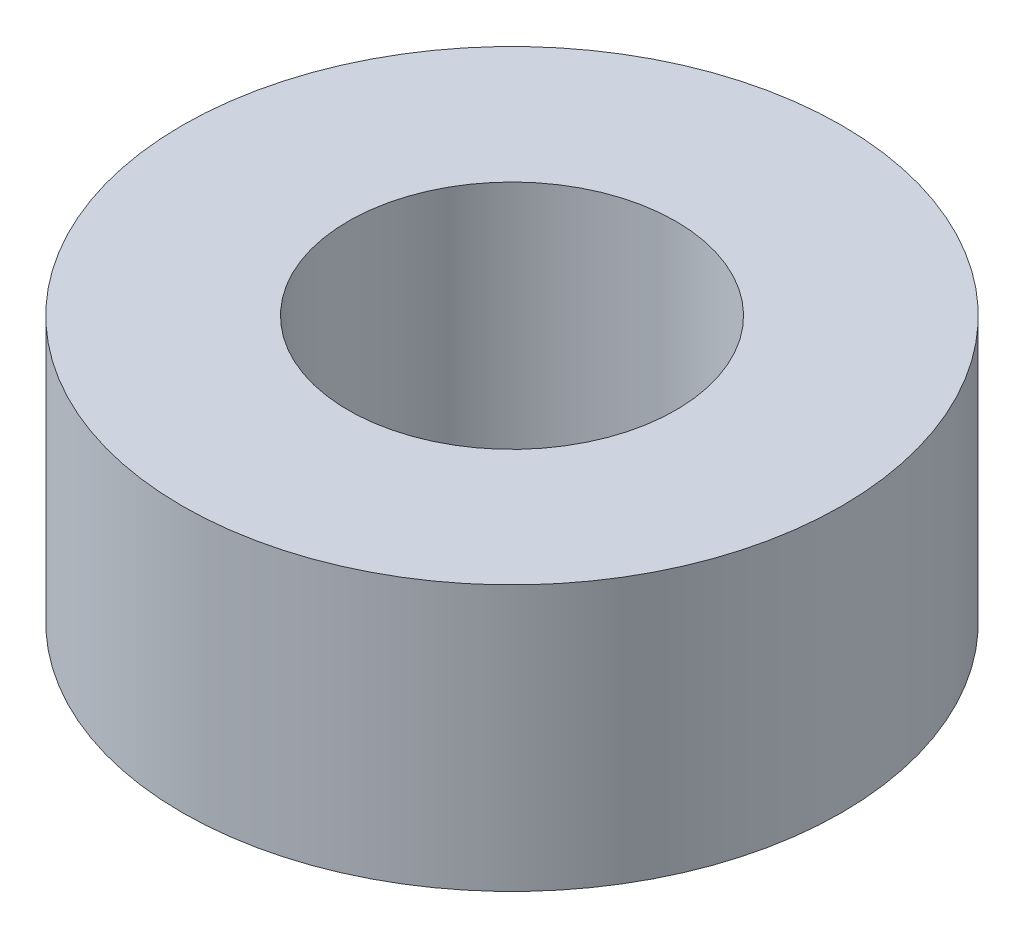
ISO-10303-21;
HEADER;
FILE_DESCRIPTION(('STEP AP214'),'2;1');
FILE_NAME('part.step','',(''),(''),'','','');
FILE_SCHEMA(('AUTOMOTIVE_DESIGN { 1 0 10303 214 1 1 1 1 }'));
ENDSEC;
DATA;
#1=APPLICATION_CONTEXT('core data for automotive mechanical design processes');
#2=APPLICATION_PROTOCOL_DEFINITION('international standard','automotive_design',2000,#1);
#3=PRODUCT_CONTEXT('',#1,'mechanical');
#4=PRODUCT('Part','Part','',(#3));
#5=PRODUCT_RELATED_PRODUCT_CATEGORY('part','',(#4));
#6=PRODUCT_DEFINITION_FORMATION('','',#4);
#7=PRODUCT_DEFINITION_CONTEXT('part definition',#1,'design');
#8=PRODUCT_DEFINITION('design','',#6,#7);
#9=PRODUCT_DEFINITION_SHAPE('','',#8);
#10=(LENGTH_UNIT() NAMED_UNIT(*) SI_UNIT(.MILLI.,.METRE.));
#11=(NAMED_UNIT(*) PLANE_ANGLE_UNIT() SI_UNIT($,.RADIAN.));
#12=(NAMED_UNIT(*) SI_UNIT($,.STERADIAN.) SOLID_ANGLE_UNIT());
#13=UNCERTAINTY_MEASURE_WITH_UNIT(LENGTH_MEASURE(1.E-05),#10,'distance_accuracy_value','');
#14=(GEOMETRIC_REPRESENTATION_CONTEXT(3) GLOBAL_UNCERTAINTY_ASSIGNED_CONTEXT((#13)) GLOBAL_UNIT_ASSIGNED_CONTEXT((#10,
#11,#12)) REPRESENTATION_CONTEXT('',''));
#15=CARTESIAN_POINT('',(0.,0.,0.));
#16=DIRECTION('',(0.,0.,1.));
#17=DIRECTION('',(1.,0.,0.));
#18=AXIS2_PLACEMENT_3D('',#15,#16,#17);
#19=CARTESIAN_POINT('',(0.,7.62,0.));
#20=DIRECTION('',(0.,1.,0.));
#21=DIRECTION('',(0.,0.,1.));
#22=AXIS2_PLACEMENT_3D('',#19,#20,#21);
#23=PLANE('',#22);
#24=CARTESIAN_POINT('',(0.,7.62,0.));
#25=DIRECTION('',(0.,1.,0.));
#26=DIRECTION('',(0.,0.,1.));
#27=AXIS2_PLACEMENT_3D('',#24,#25,#26);
#28=CIRCLE('',#27,9.4615);
#29=CARTESIAN_POINT('',(0.,7.62,-9.4615));
#30=VERTEX_POINT('',#29);
#31=EDGE_CURVE('E10',#30,#30,#28,.T.);
#32=ORIENTED_EDGE('',*,*,#31,.T.);
#33=EDGE_LOOP('',(#32));
#34=FACE_BOUND('',#33,.T.);
#35=CARTESIAN_POINT('',(0.,7.62,0.));
#36=DIRECTION('',(0.,1.,0.));
#37=DIRECTION('',(0.,0.,1.));
#38=AXIS2_PLACEMENT_3D('',#35,#36,#37);
#39=CIRCLE('',#38,4.699);
#40=CARTESIAN_POINT('',(0.,7.62,-4.699));
#41=VERTEX_POINT('',#40);
#42=EDGE_CURVE('E52',#41,#41,#39,.T.);
#43=ORIENTED_EDGE('',*,*,#42,.F.);
#44=EDGE_LOOP('',(#43));
#45=FACE_BOUND('',#44,.T.);
#46=ADVANCED_FACE('F41',(#34,#45),#23,.T.);
#47=CARTESIAN_POINT('',(0.,0.,0.));
#48=DIRECTION('',(0.,1.,0.));
#49=DIRECTION('',(0.,0.,1.));
#50=AXIS2_PLACEMENT_3D('',#47,#48,#49);
#51=PLANE('',#50);
#52=CARTESIAN_POINT('',(0.,0.,0.));
#53=DIRECTION('',(0.,1.,0.));
#54=DIRECTION('',(0.,0.,1.));
#55=AXIS2_PLACEMENT_3D('',#52,#53,#54);
#56=CIRCLE('',#55,9.4615);
#57=CARTESIAN_POINT('',(0.,0.,-9.4615));
#58=VERTEX_POINT('',#57);
#59=EDGE_CURVE('E45',#58,#58,#56,.T.);
#60=ORIENTED_EDGE('',*,*,#59,.F.);
#61=EDGE_LOOP('',(#60));
#62=FACE_BOUND('',#61,.T.);
#63=CARTESIAN_POINT('',(0.,0.,0.));
#64=DIRECTION('',(0.,1.,0.));
#65=DIRECTION('',(0.,0.,1.));
#66=AXIS2_PLACEMENT_3D('',#63,#64,#65);
#67=CIRCLE('',#66,4.699);
#68=CARTESIAN_POINT('',(0.,0.,-4.699));
#69=VERTEX_POINT('',#68);
#70=EDGE_CURVE('E54',#69,#69,#67,.T.);
#71=ORIENTED_EDGE('',*,*,#70,.T.);
#72=EDGE_LOOP('',(#71));
#73=FACE_BOUND('',#72,.T.);
#74=ADVANCED_FACE('F64',(#62,#73),#51,.F.);
#75=CARTESIAN_POINT('',(0.,7.62,0.));
#76=DIRECTION('',(0.,-1.,0.));
#77=DIRECTION('',(0.,0.,-1.));
#78=AXIS2_PLACEMENT_3D('',#75,#76,#77);
#79=CYLINDRICAL_SURFACE('',#78,9.4615);
#80=CARTESIAN_POINT('',(0.,7.62,-9.4615));
#81=CARTESIAN_POINT('',(0.,7.540625,-9.4615));
#82=CARTESIAN_POINT('',(0.,7.46125,-9.4615));
#83=CARTESIAN_POINT('',(0.,7.3025,-9.4615));
#84=CARTESIAN_POINT('',(0.,7.223125,-9.4615));
#85=CARTESIAN_POINT('',(0.,7.064375,-9.4615));
#86=CARTESIAN_POINT('',(0.,6.985,-9.4615));
#87=CARTESIAN_POINT('',(0.,6.82625,-9.4615));
#88=CARTESIAN_POINT('',(0.,6.746875,-9.4615));
#89=CARTESIAN_POINT('',(0.,6.588125,-9.4615));
#90=CARTESIAN_POINT('',(0.,6.50875,-9.4615));
#91=CARTESIAN_POINT('',(0.,6.35,-9.4615));
#92=CARTESIAN_POINT('',(0.,6.270625,-9.4615));
#93=CARTESIAN_POINT('',(0.,6.111875,-9.4615));
#94=CARTESIAN_POINT('',(0.,6.0325,-9.4615));
#95=CARTESIAN_POINT('',(0.,5.87375,-9.4615));
#96=CARTESIAN_POINT('',(0.,5.794375,-9.4615));
#97=CARTESIAN_POINT('',(0.,5.635625,-9.4615));
#98=CARTESIAN_POINT('',(0.,5.55625,-9.4615));
#99=CARTESIAN_POINT('',(0.,5.3975,-9.4615));
#100=CARTESIAN_POINT('',(0.,5.318125,-9.4615));
#101=CARTESIAN_POINT('',(0.,5.159375,-9.4615));
#102=CARTESIAN_POINT('',(0.,5.08,-9.4615));
#103=CARTESIAN_POINT('',(0.,4.92125,-9.4615));
#104=CARTESIAN_POINT('',(0.,4.841875,-9.4615));
#105=CARTESIAN_POINT('',(0.,4.683125,-9.4615));
#106=CARTESIAN_POINT('',(0.,4.60375,-9.4615));
#107=CARTESIAN_POINT('',(0.,4.445,-9.4615));
#108=CARTESIAN_POINT('',(0.,4.365625,-9.4615));
#109=CARTESIAN_POINT('',(0.,4.206875,-9.4615));
#110=CARTESIAN_POINT('',(0.,4.1275,-9.4615));
#111=CARTESIAN_POINT('',(0.,3.96875,-9.4615));
#112=CARTESIAN_POINT('',(0.,3.889375,-9.4615));
#113=CARTESIAN_POINT('',(0.,3.730625,-9.4615));
#114=CARTESIAN_POINT('',(0.,3.65125,-9.4615));
#115=CARTESIAN_POINT('',(0.,3.4925,-9.4615));
#116=CARTESIAN_POINT('',(0.,3.413125,-9.4615));
#117=CARTESIAN_POINT('',(0.,3.254375,-9.4615));
#118=CARTESIAN_POINT('',(0.,3.175,-9.4615));
#119=CARTESIAN_POINT('',(0.,3.01625,-9.4615));
#120=CARTESIAN_POINT('',(0.,2.936875,-9.4615));
#121=CARTESIAN_POINT('',(0.,2.778125,-9.4615));
#122=CARTESIAN_POINT('',(0.,2.69875,-9.4615));
#123=CARTESIAN_POINT('',(0.,2.54,-9.4615));
#124=CARTESIAN_POINT('',(0.,2.460625,-9.4615));
#125=CARTESIAN_POINT('',(0.,2.301875,-9.4615));
#126=CARTESIAN_POINT('',(0.,2.2225,-9.4615));
#127=CARTESIAN_POINT('',(0.,2.06375,-9.4615));
#128=CARTESIAN_POINT('',(0.,1.984375,-9.4615));
#129=CARTESIAN_POINT('',(0.,1.825625,-9.4615));
#130=CARTESIAN_POINT('',(0.,1.74625,-9.4615));
#131=CARTESIAN_POINT('',(0.,1.5875,-9.4615));
#132=CARTESIAN_POINT('',(0.,1.508125,-9.4615));
#133=CARTESIAN_POINT('',(0.,1.349375,-9.4615));
#134=CARTESIAN_POINT('',(0.,1.27,-9.4615));
#135=CARTESIAN_POINT('',(0.,1.11125,-9.4615));
#136=CARTESIAN_POINT('',(0.,1.031875,-9.4615));
#137=CARTESIAN_POINT('',(0.,0.873125,-9.4615));
#138=CARTESIAN_POINT('',(0.,0.79375,-9.4615));
#139=CARTESIAN_POINT('',(0.,0.635,-9.4615));
#140=CARTESIAN_POINT('',(0.,0.555625,-9.4615));
#141=CARTESIAN_POINT('',(0.,0.396875,-9.4615));
#142=CARTESIAN_POINT('',(0.,0.3175,-9.4615));
#143=CARTESIAN_POINT('',(0.,0.15875,-9.4615));
#144=CARTESIAN_POINT('',(0.,0.0793749999999999,-9.4615));
#145=CARTESIAN_POINT('',(0.,0.,-9.4615));
#146=B_SPLINE_CURVE_WITH_KNOTS('',3,(#80,#81,#82,#83,#84,#85,#86,#87,#88,#89,#90,#91,#92,#93,
#94,#95,#96,#97,#98,#99,#100,#101,#102,#103,#104,#105,#106,#107,#108,#109,#110,#111,#112,#113,
#114,#115,#116,#117,#118,#119,#120,#121,#122,#123,#124,#125,#126,#127,#128,#129,#130,#131,#132,
#133,#134,#135,#136,#137,#138,#139,#140,#141,#142,#143,#144,#145),.UNSPECIFIED.,.F.,.F.,(4,2,2,
2,2,2,2,2,2,2,2,2,2,2,2,2,2,2,2,2,2,2,2,2,2,2,2,2,2,2,2,2,4),(0.,0.238125,0.476249999999999,
0.714375,0.952499999999999,1.190625,1.42875,1.666875,1.905,2.143125,2.38125,2.619375,2.8575,
3.095625,3.33375,3.571875,3.81,4.048125,4.28625,4.524375,4.7625,5.000625,5.23875,5.476875,5.715,
5.953125,6.19125,6.429375,6.6675,6.905625,7.14375,7.381875,7.62),.UNSPECIFIED.);
#147=EDGE_CURVE('BSEAM43',#30,#58,#146,.T.);
#148=ORIENTED_EDGE('',*,*,#31,.F.);
#149=ORIENTED_EDGE('',*,*,#59,.T.);
#150=ORIENTED_EDGE('',*,*,#147,.T.);
#151=ORIENTED_EDGE('',*,*,#147,.F.);
#152=EDGE_LOOP('',(#148,#150,#149,#151));
#153=FACE_BOUND('',#152,.T.);
#154=ADVANCED_FACE('F43',(#153),#79,.T.);
#155=CARTESIAN_POINT('',(0.,7.62,0.));
#156=DIRECTION('',(0.,-1.,0.));
#157=DIRECTION('',(0.,0.,-1.));
#158=AXIS2_PLACEMENT_3D('',#155,#156,#157);
#159=CYLINDRICAL_SURFACE('',#158,4.699);
#160=CARTESIAN_POINT('',(0.,7.62,-4.699));
#161=CARTESIAN_POINT('',(0.,7.540625,-4.699));
#162=CARTESIAN_POINT('',(0.,7.46125,-4.699));
#163=CARTESIAN_POINT('',(0.,7.3025,-4.699));
#164=CARTESIAN_POINT('',(0.,7.223125,-4.699));
#165=CARTESIAN_POINT('',(0.,7.064375,-4.699));
#166=CARTESIAN_POINT('',(0.,6.985,-4.699));
#167=CARTESIAN_POINT('',(0.,6.82625,-4.699));
#168=CARTESIAN_POINT('',(0.,6.746875,-4.699));
#169=CARTESIAN_POINT('',(0.,6.588125,-4.699));
#170=CARTESIAN_POINT('',(0.,6.50875,-4.699));
#171=CARTESIAN_POINT('',(0.,6.35,-4.699));
#172=CARTESIAN_POINT('',(0.,6.270625,-4.699));
#173=CARTESIAN_POINT('',(0.,6.111875,-4.699));
#174=CARTESIAN_POINT('',(0.,6.0325,-4.699));
#175=CARTESIAN_POINT('',(0.,5.87375,-4.699));
#176=CARTESIAN_POINT('',(0.,5.794375,-4.699));
#177=CARTESIAN_POINT('',(0.,5.635625,-4.699));
#178=CARTESIAN_POINT('',(0.,5.55625,-4.699));
#179=CARTESIAN_POINT('',(0.,5.3975,-4.699));
#180=CARTESIAN_POINT('',(0.,5.318125,-4.699));
#181=CARTESIAN_POINT('',(0.,5.159375,-4.699));
#182=CARTESIAN_POINT('',(0.,5.08,-4.699));
#183=CARTESIAN_POINT('',(0.,4.92125,-4.699));
#184=CARTESIAN_POINT('',(0.,4.841875,-4.699));
#185=CARTESIAN_POINT('',(0.,4.683125,-4.699));
#186=CARTESIAN_POINT('',(0.,4.60375,-4.699));
#187=CARTESIAN_POINT('',(0.,4.445,-4.699));
#188=CARTESIAN_POINT('',(0.,4.365625,-4.699));
#189=CARTESIAN_POINT('',(0.,4.206875,-4.699));
#190=CARTESIAN_POINT('',(0.,4.1275,-4.699));
#191=CARTESIAN_POINT('',(0.,3.96875,-4.699));
#192=CARTESIAN_POINT('',(0.,3.889375,-4.699));
#193=CARTESIAN_POINT('',(0.,3.730625,-4.699));
#194=CARTESIAN_POINT('',(0.,3.65125,-4.699));
#195=CARTESIAN_POINT('',(0.,3.4925,-4.699));
#196=CARTESIAN_POINT('',(0.,3.413125,-4.699));
#197=CARTESIAN_POINT('',(0.,3.254375,-4.699));
#198=CARTESIAN_POINT('',(0.,3.175,-4.699));
#199=CARTESIAN_POINT('',(0.,3.01625,-4.699));
#200=CARTESIAN_POINT('',(0.,2.936875,-4.699));
#201=CARTESIAN_POINT('',(0.,2.778125,-4.699));
#202=CARTESIAN_POINT('',(0.,2.69875,-4.699));
#203=CARTESIAN_POINT('',(0.,2.54,-4.699));
#204=CARTESIAN_POINT('',(0.,2.460625,-4.699));
#205=CARTESIAN_POINT('',(0.,2.301875,-4.699));
#206=CARTESIAN_POINT('',(0.,2.2225,-4.699));
#207=CARTESIAN_POINT('',(0.,2.06375,-4.699));
#208=CARTESIAN_POINT('',(0.,1.984375,-4.699));
#209=CARTESIAN_POINT('',(0.,1.825625,-4.699));
#210=CARTESIAN_POINT('',(0.,1.74625,-4.699));
#211=CARTESIAN_POINT('',(0.,1.5875,-4.699));
#212=CARTESIAN_POINT('',(0.,1.508125,-4.699));
#213=CARTESIAN_POINT('',(0.,1.349375,-4.699));
#214=CARTESIAN_POINT('',(0.,1.27,-4.699));
#215=CARTESIAN_POINT('',(0.,1.11125,-4.699));
#216=CARTESIAN_POINT('',(0.,1.031875,-4.699));
#217=CARTESIAN_POINT('',(0.,0.873125,-4.699));
#218=CARTESIAN_POINT('',(0.,0.79375,-4.699));
#219=CARTESIAN_POINT('',(0.,0.635,-4.699));
#220=CARTESIAN_POINT('',(0.,0.555625,-4.699));
#221=CARTESIAN_POINT('',(0.,0.396875,-4.699));
#222=CARTESIAN_POINT('',(0.,0.3175,-4.699));
#223=CARTESIAN_POINT('',(0.,0.15875,-4.699));
#224=CARTESIAN_POINT('',(0.,0.0793749999999999,-4.699));
#225=CARTESIAN_POINT('',(0.,0.,-4.699));
#226=B_SPLINE_CURVE_WITH_KNOTS('',3,(#160,#161,#162,#163,#164,#165,#166,#167,#168,#169,#170,
#171,#172,#173,#174,#175,#176,#177,#178,#179,#180,#181,#182,#183,#184,#185,#186,#187,#188,#189,
#190,#191,#192,#193,#194,#195,#196,#197,#198,#199,#200,#201,#202,#203,#204,#205,#206,#207,#208,
#209,#210,#211,#212,#213,#214,#215,#216,#217,#218,#219,#220,#221,#222,#223,#224,#225),
.UNSPECIFIED.,.F.,.F.,(4,2,2,2,2,2,2,2,2,2,2,2,2,2,2,2,2,2,2,2,2,2,2,2,2,2,2,2,2,2,2,2,4),(0.,
0.238125,0.476249999999999,0.714375,0.952499999999999,1.190625,1.42875,1.666875,1.905,2.143125,
2.38125,2.619375,2.8575,3.095625,3.33375,3.571875,3.81,4.048125,4.28625,4.524375,4.7625,
5.000625,5.23875,5.476875,5.715,5.953125,6.19125,6.429375,6.6675,6.905625,7.14375,7.381875,
7.62),.UNSPECIFIED.);
#227=EDGE_CURVE('BSEAM60',#41,#69,#226,.T.);
#228=ORIENTED_EDGE('',*,*,#42,.T.);
#229=ORIENTED_EDGE('',*,*,#70,.F.);
#230=ORIENTED_EDGE('',*,*,#227,.T.);
#231=ORIENTED_EDGE('',*,*,#227,.F.);
#232=EDGE_LOOP('',(#228,#230,#229,#231));
#233=FACE_BOUND('',#232,.T.);
#234=ADVANCED_FACE('F60',(#233),#159,.F.);
#235=CLOSED_SHELL('',(#46,#74,#154,#234));
#236=MANIFOLD_SOLID_BREP('B2',#235);
#237=ADVANCED_BREP_SHAPE_REPRESENTATION('',(#18,#236),#14);
#238=SHAPE_DEFINITION_REPRESENTATION(#9,#237);
ENDSEC;
END-ISO-10303-21;
